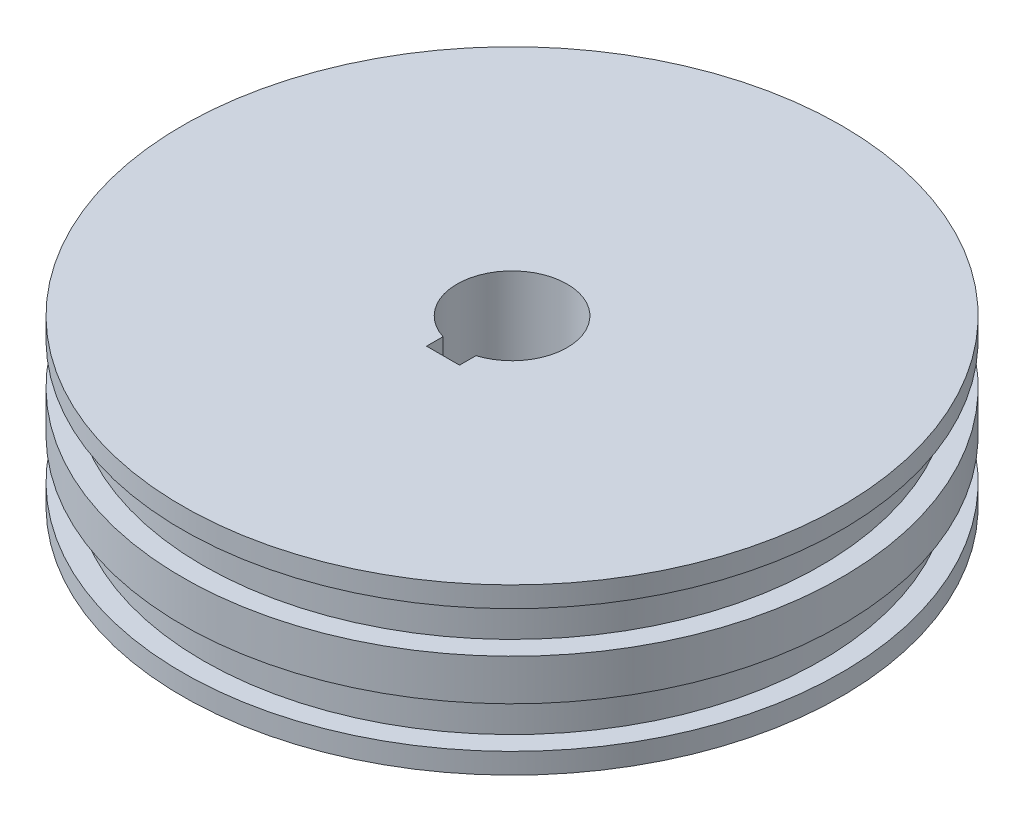
ISO-10303-21;
HEADER;
FILE_DESCRIPTION(('STEP AP214'),'2;1');
FILE_NAME('part.step','',(''),(''),'','','');
FILE_SCHEMA(('AUTOMOTIVE_DESIGN { 1 0 10303 214 1 1 1 1 }'));
ENDSEC;
DATA;
#1=APPLICATION_CONTEXT('core data for automotive mechanical design processes');
#2=APPLICATION_PROTOCOL_DEFINITION('international standard','automotive_design',2000,#1);
#3=PRODUCT_CONTEXT('',#1,'mechanical');
#4=PRODUCT('Part','Part','',(#3));
#5=PRODUCT_RELATED_PRODUCT_CATEGORY('part','',(#4));
#6=PRODUCT_DEFINITION_FORMATION('','',#4);
#7=PRODUCT_DEFINITION_CONTEXT('part definition',#1,'design');
#8=PRODUCT_DEFINITION('design','',#6,#7);
#9=PRODUCT_DEFINITION_SHAPE('','',#8);
#10=(LENGTH_UNIT() NAMED_UNIT(*) SI_UNIT(.MILLI.,.METRE.));
#11=(NAMED_UNIT(*) PLANE_ANGLE_UNIT() SI_UNIT($,.RADIAN.));
#12=(NAMED_UNIT(*) SI_UNIT($,.STERADIAN.) SOLID_ANGLE_UNIT());
#13=UNCERTAINTY_MEASURE_WITH_UNIT(LENGTH_MEASURE(1.E-05),#10,'distance_accuracy_value','');
#14=(GEOMETRIC_REPRESENTATION_CONTEXT(3) GLOBAL_UNCERTAINTY_ASSIGNED_CONTEXT((#13)) GLOBAL_UNIT_ASSIGNED_CONTEXT((#10,
#11,#12)) REPRESENTATION_CONTEXT('',''));
#15=CARTESIAN_POINT('',(0.,0.,0.));
#16=DIRECTION('',(0.,0.,1.));
#17=DIRECTION('',(1.,0.,0.));
#18=AXIS2_PLACEMENT_3D('',#15,#16,#17);
#19=CARTESIAN_POINT('',(0.,0.,-10.));
#20=DIRECTION('',(0.,-1.,0.));
#21=DIRECTION('',(0.,0.,-1.));
#22=AXIS2_PLACEMENT_3D('',#19,#20,#21);
#23=PLANE('',#22);
#24=CARTESIAN_POINT('',(0.,0.,0.));
#25=DIRECTION('',(0.,-1.,0.));
#26=DIRECTION('',(0.,0.,-1.));
#27=AXIS2_PLACEMENT_3D('',#24,#25,#26);
#28=CIRCLE('',#27,13.368580060423);
#29=CARTESIAN_POINT('',(-4.,0.,12.7561331457436));
#30=VERTEX_POINT('',#29);
#31=CARTESIAN_POINT('',(4.,0.,12.7561331457436));
#32=VERTEX_POINT('',#31);
#33=EDGE_CURVE('E55',#30,#32,#28,.T.);
#34=ORIENTED_EDGE('',*,*,#33,.F.);
#35=DIRECTION('',(0.,0.,-1.));
#36=VECTOR('',#35,1.);
#37=CARTESIAN_POINT('',(-4.,0.,16.7561331457436));
#38=LINE('',#37,#36);
#39=CARTESIAN_POINT('',(-4.,0.,16.7561331457436));
#40=VERTEX_POINT('',#39);
#41=EDGE_CURVE('E102',#40,#30,#38,.T.);
#42=ORIENTED_EDGE('',*,*,#41,.F.);
#43=DIRECTION('',(-1.,0.,0.));
#44=VECTOR('',#43,1.);
#45=CARTESIAN_POINT('',(-4.,0.,16.7561331457436));
#46=LINE('',#45,#44);
#47=CARTESIAN_POINT('',(4.,0.,16.7561331457436));
#48=VERTEX_POINT('',#47);
#49=EDGE_CURVE('E106',#48,#40,#46,.T.);
#50=ORIENTED_EDGE('',*,*,#49,.F.);
#51=DIRECTION('',(0.,0.,1.));
#52=VECTOR('',#51,1.);
#53=CARTESIAN_POINT('',(4.,0.,16.7561331457436));
#54=LINE('',#53,#52);
#55=EDGE_CURVE('E115',#32,#48,#54,.T.);
#56=ORIENTED_EDGE('',*,*,#55,.F.);
#57=EDGE_LOOP('',(#34,#42,#50,#56));
#58=FACE_BOUND('',#57,.T.);
#59=CARTESIAN_POINT('',(0.,0.,0.));
#60=DIRECTION('',(0.,-1.,0.));
#61=DIRECTION('',(0.,0.,-1.));
#62=AXIS2_PLACEMENT_3D('',#59,#60,#61);
#63=CIRCLE('',#62,80.);
#64=CARTESIAN_POINT('',(0.,0.,-80.));
#65=VERTEX_POINT('',#64);
#66=EDGE_CURVE('E11',#65,#65,#63,.T.);
#67=ORIENTED_EDGE('',*,*,#66,.T.);
#68=EDGE_LOOP('',(#67));
#69=FACE_BOUND('',#68,.T.);
#70=ADVANCED_FACE('F40',(#58,#69),#23,.T.);
#71=CARTESIAN_POINT('',(0.,0.,0.));
#72=DIRECTION('',(0.,-1.,0.));
#73=DIRECTION('',(0.,0.,-1.));
#74=AXIS2_PLACEMENT_3D('',#71,#72,#73);
#75=CYLINDRICAL_SURFACE('',#74,80.);
#76=CARTESIAN_POINT('',(0.,5.,0.));
#77=DIRECTION('',(0.,-1.,0.));
#78=DIRECTION('',(0.,0.,-1.));
#79=AXIS2_PLACEMENT_3D('',#76,#77,#78);
#80=CIRCLE('',#79,80.);
#81=CARTESIAN_POINT('',(0.,5.,-80.));
#82=VERTEX_POINT('',#81);
#83=EDGE_CURVE('E48',#82,#82,#80,.T.);
#84=ORIENTED_EDGE('',*,*,#83,.T.);
#85=EDGE_LOOP('',(#84));
#86=FACE_BOUND('',#85,.T.);
#87=ORIENTED_EDGE('',*,*,#66,.F.);
#88=EDGE_LOOP('',(#87));
#89=FACE_BOUND('',#88,.T.);
#90=ADVANCED_FACE('F164',(#86,#89),#75,.T.);
#91=CARTESIAN_POINT('',(0.,5.,-80.));
#92=DIRECTION('',(0.,1.,0.));
#93=DIRECTION('',(0.,0.,1.));
#94=AXIS2_PLACEMENT_3D('',#91,#92,#93);
#95=PLANE('',#94);
#96=CARTESIAN_POINT('',(0.,5.,0.));
#97=DIRECTION('',(0.,-1.,0.));
#98=DIRECTION('',(0.,0.,-1.));
#99=AXIS2_PLACEMENT_3D('',#96,#97,#98);
#100=CIRCLE('',#99,75.);
#101=CARTESIAN_POINT('',(0.,5.,-75.));
#102=VERTEX_POINT('',#101);
#103=EDGE_CURVE('E157',#102,#102,#100,.T.);
#104=ORIENTED_EDGE('',*,*,#103,.T.);
#105=EDGE_LOOP('',(#104));
#106=FACE_BOUND('',#105,.T.);
#107=ORIENTED_EDGE('',*,*,#83,.F.);
#108=EDGE_LOOP('',(#107));
#109=FACE_BOUND('',#108,.T.);
#110=ADVANCED_FACE('F167',(#106,#109),#95,.T.);
#111=CARTESIAN_POINT('',(0.,0.,0.));
#112=DIRECTION('',(0.,-1.,0.));
#113=DIRECTION('',(0.,0.,-1.));
#114=AXIS2_PLACEMENT_3D('',#111,#112,#113);
#115=CYLINDRICAL_SURFACE('',#114,75.);
#116=CARTESIAN_POINT('',(0.,15.,0.));
#117=DIRECTION('',(0.,-1.,0.));
#118=DIRECTION('',(0.,0.,-1.));
#119=AXIS2_PLACEMENT_3D('',#116,#117,#118);
#120=CIRCLE('',#119,75.);
#121=CARTESIAN_POINT('',(0.,15.,-75.));
#122=VERTEX_POINT('',#121);
#123=EDGE_CURVE('E153',#122,#122,#120,.T.);
#124=ORIENTED_EDGE('',*,*,#123,.T.);
#125=EDGE_LOOP('',(#124));
#126=FACE_BOUND('',#125,.T.);
#127=ORIENTED_EDGE('',*,*,#103,.F.);
#128=EDGE_LOOP('',(#127));
#129=FACE_BOUND('',#128,.T.);
#130=ADVANCED_FACE('F169',(#126,#129),#115,.T.);
#131=CARTESIAN_POINT('',(0.,15.,-75.));
#132=DIRECTION('',(0.,-1.,0.));
#133=DIRECTION('',(0.,0.,-1.));
#134=AXIS2_PLACEMENT_3D('',#131,#132,#133);
#135=PLANE('',#134);
#136=CARTESIAN_POINT('',(0.,15.,0.));
#137=DIRECTION('',(0.,-1.,0.));
#138=DIRECTION('',(0.,0.,-1.));
#139=AXIS2_PLACEMENT_3D('',#136,#137,#138);
#140=CIRCLE('',#139,80.);
#141=CARTESIAN_POINT('',(0.,15.,-80.));
#142=VERTEX_POINT('',#141);
#143=EDGE_CURVE('E149',#142,#142,#140,.T.);
#144=ORIENTED_EDGE('',*,*,#143,.T.);
#145=EDGE_LOOP('',(#144));
#146=FACE_BOUND('',#145,.T.);
#147=ORIENTED_EDGE('',*,*,#123,.F.);
#148=EDGE_LOOP('',(#147));
#149=FACE_BOUND('',#148,.T.);
#150=ADVANCED_FACE('F176',(#146,#149),#135,.T.);
#151=CARTESIAN_POINT('',(0.,0.,0.));
#152=DIRECTION('',(0.,-1.,0.));
#153=DIRECTION('',(0.,0.,-1.));
#154=AXIS2_PLACEMENT_3D('',#151,#152,#153);
#155=CYLINDRICAL_SURFACE('',#154,80.);
#156=CARTESIAN_POINT('',(0.,25.,0.));
#157=DIRECTION('',(0.,-1.,0.));
#158=DIRECTION('',(0.,0.,-1.));
#159=AXIS2_PLACEMENT_3D('',#156,#157,#158);
#160=CIRCLE('',#159,80.);
#161=CARTESIAN_POINT('',(0.,25.,-80.));
#162=VERTEX_POINT('',#161);
#163=EDGE_CURVE('E145',#162,#162,#160,.T.);
#164=ORIENTED_EDGE('',*,*,#163,.T.);
#165=EDGE_LOOP('',(#164));
#166=FACE_BOUND('',#165,.T.);
#167=ORIENTED_EDGE('',*,*,#143,.F.);
#168=EDGE_LOOP('',(#167));
#169=FACE_BOUND('',#168,.T.);
#170=ADVANCED_FACE('F218',(#166,#169),#155,.T.);
#171=CARTESIAN_POINT('',(0.,25.,-75.));
#172=DIRECTION('',(0.,1.,0.));
#173=DIRECTION('',(0.,0.,1.));
#174=AXIS2_PLACEMENT_3D('',#171,#172,#173);
#175=PLANE('',#174);
#176=CARTESIAN_POINT('',(0.,25.,0.));
#177=DIRECTION('',(0.,-1.,0.));
#178=DIRECTION('',(0.,0.,-1.));
#179=AXIS2_PLACEMENT_3D('',#176,#177,#178);
#180=CIRCLE('',#179,75.);
#181=CARTESIAN_POINT('',(0.,25.,-75.));
#182=VERTEX_POINT('',#181);
#183=EDGE_CURVE('E141',#182,#182,#180,.T.);
#184=ORIENTED_EDGE('',*,*,#183,.T.);
#185=EDGE_LOOP('',(#184));
#186=FACE_BOUND('',#185,.T.);
#187=ORIENTED_EDGE('',*,*,#163,.F.);
#188=EDGE_LOOP('',(#187));
#189=FACE_BOUND('',#188,.T.);
#190=ADVANCED_FACE('F214',(#186,#189),#175,.T.);
#191=CARTESIAN_POINT('',(0.,0.,0.));
#192=DIRECTION('',(0.,-1.,0.));
#193=DIRECTION('',(0.,0.,-1.));
#194=AXIS2_PLACEMENT_3D('',#191,#192,#193);
#195=CYLINDRICAL_SURFACE('',#194,75.);
#196=CARTESIAN_POINT('',(0.,35.,0.));
#197=DIRECTION('',(0.,-1.,0.));
#198=DIRECTION('',(0.,0.,-1.));
#199=AXIS2_PLACEMENT_3D('',#196,#197,#198);
#200=CIRCLE('',#199,75.);
#201=CARTESIAN_POINT('',(0.,35.,-75.));
#202=VERTEX_POINT('',#201);
#203=EDGE_CURVE('E137',#202,#202,#200,.T.);
#204=ORIENTED_EDGE('',*,*,#203,.T.);
#205=EDGE_LOOP('',(#204));
#206=FACE_BOUND('',#205,.T.);
#207=ORIENTED_EDGE('',*,*,#183,.F.);
#208=EDGE_LOOP('',(#207));
#209=FACE_BOUND('',#208,.T.);
#210=ADVANCED_FACE('F210',(#206,#209),#195,.T.);
#211=CARTESIAN_POINT('',(0.,35.,-75.));
#212=DIRECTION('',(0.,-1.,0.));
#213=DIRECTION('',(0.,0.,-1.));
#214=AXIS2_PLACEMENT_3D('',#211,#212,#213);
#215=PLANE('',#214);
#216=CARTESIAN_POINT('',(0.,35.,0.));
#217=DIRECTION('',(0.,-1.,0.));
#218=DIRECTION('',(0.,0.,-1.));
#219=AXIS2_PLACEMENT_3D('',#216,#217,#218);
#220=CIRCLE('',#219,80.);
#221=CARTESIAN_POINT('',(0.,35.,-80.));
#222=VERTEX_POINT('',#221);
#223=EDGE_CURVE('E133',#222,#222,#220,.T.);
#224=ORIENTED_EDGE('',*,*,#223,.T.);
#225=EDGE_LOOP('',(#224));
#226=FACE_BOUND('',#225,.T.);
#227=ORIENTED_EDGE('',*,*,#203,.F.);
#228=EDGE_LOOP('',(#227));
#229=FACE_BOUND('',#228,.T.);
#230=ADVANCED_FACE('F206',(#226,#229),#215,.T.);
#231=CARTESIAN_POINT('',(0.,0.,0.));
#232=DIRECTION('',(0.,-1.,0.));
#233=DIRECTION('',(0.,0.,-1.));
#234=AXIS2_PLACEMENT_3D('',#231,#232,#233);
#235=CYLINDRICAL_SURFACE('',#234,80.);
#236=CARTESIAN_POINT('',(0.,40.,0.));
#237=DIRECTION('',(0.,-1.,0.));
#238=DIRECTION('',(0.,0.,-1.));
#239=AXIS2_PLACEMENT_3D('',#236,#237,#238);
#240=CIRCLE('',#239,80.);
#241=CARTESIAN_POINT('',(0.,40.,-80.));
#242=VERTEX_POINT('',#241);
#243=EDGE_CURVE('E124',#242,#242,#240,.T.);
#244=ORIENTED_EDGE('',*,*,#243,.T.);
#245=EDGE_LOOP('',(#244));
#246=FACE_BOUND('',#245,.T.);
#247=ORIENTED_EDGE('',*,*,#223,.F.);
#248=EDGE_LOOP('',(#247));
#249=FACE_BOUND('',#248,.T.);
#250=ADVANCED_FACE('F203',(#246,#249),#235,.T.);
#251=CARTESIAN_POINT('',(0.,40.,-80.));
#252=DIRECTION('',(0.,1.,0.));
#253=DIRECTION('',(0.,0.,1.));
#254=AXIS2_PLACEMENT_3D('',#251,#252,#253);
#255=PLANE('',#254);
#256=CARTESIAN_POINT('',(0.,40.,0.));
#257=DIRECTION('',(0.,-1.,0.));
#258=DIRECTION('',(0.,0.,-1.));
#259=AXIS2_PLACEMENT_3D('',#256,#257,#258);
#260=CIRCLE('',#259,13.368580060423);
#261=CARTESIAN_POINT('',(-4.,40.,12.7561331457436));
#262=VERTEX_POINT('',#261);
#263=CARTESIAN_POINT('',(4.,40.,12.7561331457436));
#264=VERTEX_POINT('',#263);
#265=EDGE_CURVE('E83',#262,#264,#260,.T.);
#266=ORIENTED_EDGE('',*,*,#265,.T.);
#267=DIRECTION('',(0.,0.,1.));
#268=VECTOR('',#267,1.);
#269=CARTESIAN_POINT('',(4.,40.,16.7561331457436));
#270=LINE('',#269,#268);
#271=CARTESIAN_POINT('',(4.,40.,16.7561331457436));
#272=VERTEX_POINT('',#271);
#273=EDGE_CURVE('E93',#264,#272,#270,.T.);
#274=ORIENTED_EDGE('',*,*,#273,.T.);
#275=DIRECTION('',(-1.,0.,0.));
#276=VECTOR('',#275,1.);
#277=CARTESIAN_POINT('',(-4.,40.,16.7561331457436));
#278=LINE('',#277,#276);
#279=CARTESIAN_POINT('',(-4.,40.,16.7561331457436));
#280=VERTEX_POINT('',#279);
#281=EDGE_CURVE('E63',#272,#280,#278,.T.);
#282=ORIENTED_EDGE('',*,*,#281,.T.);
#283=DIRECTION('',(0.,0.,-1.));
#284=VECTOR('',#283,1.);
#285=CARTESIAN_POINT('',(-4.,40.,16.7561331457436));
#286=LINE('',#285,#284);
#287=EDGE_CURVE('E90',#280,#262,#286,.T.);
#288=ORIENTED_EDGE('',*,*,#287,.T.);
#289=EDGE_LOOP('',(#266,#274,#282,#288));
#290=FACE_BOUND('',#289,.T.);
#291=ORIENTED_EDGE('',*,*,#243,.F.);
#292=EDGE_LOOP('',(#291));
#293=FACE_BOUND('',#292,.T.);
#294=ADVANCED_FACE('F98',(#290,#293),#255,.T.);
#295=CARTESIAN_POINT('',(0.,40.,0.));
#296=DIRECTION('',(0.,-1.,0.));
#297=DIRECTION('',(0.,0.,-1.));
#298=AXIS2_PLACEMENT_3D('',#295,#296,#297);
#299=CYLINDRICAL_SURFACE('',#298,13.368580060423);
#300=ORIENTED_EDGE('',*,*,#33,.T.);
#301=DIRECTION('',(0.,-1.,0.));
#302=VECTOR('',#301,1.);
#303=CARTESIAN_POINT('',(4.,40.,12.7561331457436));
#304=LINE('',#303,#302);
#305=EDGE_CURVE('E79',#264,#32,#304,.T.);
#306=ORIENTED_EDGE('',*,*,#305,.F.);
#307=ORIENTED_EDGE('',*,*,#265,.F.);
#308=DIRECTION('',(0.,-1.,0.));
#309=VECTOR('',#308,1.);
#310=CARTESIAN_POINT('',(-4.,40.,12.7561331457436));
#311=LINE('',#310,#309);
#312=EDGE_CURVE('E121',#262,#30,#311,.T.);
#313=ORIENTED_EDGE('',*,*,#312,.T.);
#314=EDGE_LOOP('',(#300,#306,#307,#313));
#315=FACE_BOUND('',#314,.T.);
#316=ADVANCED_FACE('F81',(#315),#299,.F.);
#317=CARTESIAN_POINT('',(-4.,40.,16.7561331457436));
#318=DIRECTION('',(-1.,0.,0.));
#319=DIRECTION('',(0.,0.,1.));
#320=AXIS2_PLACEMENT_3D('',#317,#318,#319);
#321=PLANE('',#320);
#322=ORIENTED_EDGE('',*,*,#41,.T.);
#323=ORIENTED_EDGE('',*,*,#312,.F.);
#324=ORIENTED_EDGE('',*,*,#287,.F.);
#325=DIRECTION('',(0.,-1.,0.));
#326=VECTOR('',#325,1.);
#327=CARTESIAN_POINT('',(-4.,40.,16.7561331457436));
#328=LINE('',#327,#326);
#329=EDGE_CURVE('E125',#280,#40,#328,.T.);
#330=ORIENTED_EDGE('',*,*,#329,.T.);
#331=EDGE_LOOP('',(#322,#323,#324,#330));
#332=FACE_BOUND('',#331,.T.);
#333=ADVANCED_FACE('F189',(#332),#321,.F.);
#334=CARTESIAN_POINT('',(-4.,40.,16.7561331457436));
#335=DIRECTION('',(0.,0.,1.));
#336=DIRECTION('',(1.,0.,0.));
#337=AXIS2_PLACEMENT_3D('',#334,#335,#336);
#338=PLANE('',#337);
#339=ORIENTED_EDGE('',*,*,#49,.T.);
#340=ORIENTED_EDGE('',*,*,#329,.F.);
#341=ORIENTED_EDGE('',*,*,#281,.F.);
#342=DIRECTION('',(0.,-1.,0.));
#343=VECTOR('',#342,1.);
#344=CARTESIAN_POINT('',(4.,40.,16.7561331457436));
#345=LINE('',#344,#343);
#346=EDGE_CURVE('E89',#272,#48,#345,.T.);
#347=ORIENTED_EDGE('',*,*,#346,.T.);
#348=EDGE_LOOP('',(#339,#340,#341,#347));
#349=FACE_BOUND('',#348,.T.);
#350=ADVANCED_FACE('F187',(#349),#338,.F.);
#351=CARTESIAN_POINT('',(4.,40.,16.7561331457436));
#352=DIRECTION('',(1.,0.,0.));
#353=DIRECTION('',(0.,0.,-1.));
#354=AXIS2_PLACEMENT_3D('',#351,#352,#353);
#355=PLANE('',#354);
#356=ORIENTED_EDGE('',*,*,#55,.T.);
#357=ORIENTED_EDGE('',*,*,#346,.F.);
#358=ORIENTED_EDGE('',*,*,#273,.F.);
#359=ORIENTED_EDGE('',*,*,#305,.T.);
#360=EDGE_LOOP('',(#356,#357,#358,#359));
#361=FACE_BOUND('',#360,.T.);
#362=ADVANCED_FACE('F94',(#361),#355,.F.);
#363=CLOSED_SHELL('',(#70,#90,#110,#130,#150,#170,#190,#210,#230,#250,#294,#316,#333,#350,#362));
#364=MANIFOLD_SOLID_BREP('B2',#363);
#365=ADVANCED_BREP_SHAPE_REPRESENTATION('',(#18,#364),#14);
#366=SHAPE_DEFINITION_REPRESENTATION(#9,#365);
ENDSEC;
END-ISO-10303-21;
